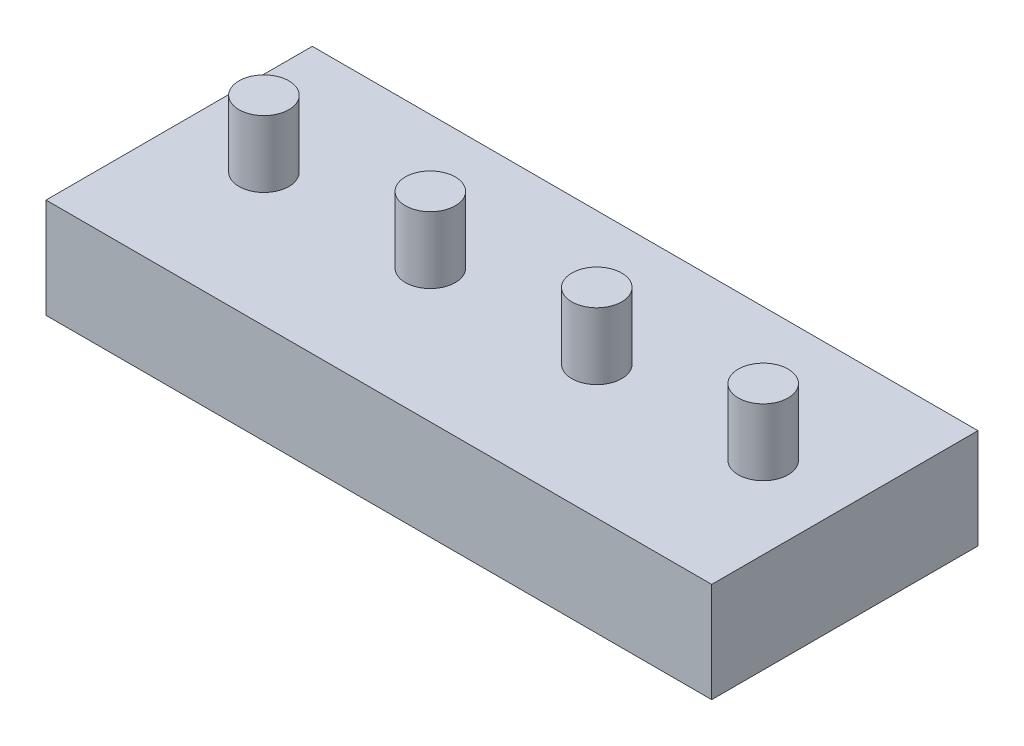
ISO-10303-21;
HEADER;
FILE_DESCRIPTION(('STEP AP214'),'2;1');
FILE_NAME('part.step','',(''),(''),'','','');
FILE_SCHEMA(('AUTOMOTIVE_DESIGN { 1 0 10303 214 1 1 1 1 }'));
ENDSEC;
DATA;
#1=APPLICATION_CONTEXT('core data for automotive mechanical design processes');
#2=APPLICATION_PROTOCOL_DEFINITION('international standard','automotive_design',2000,#1);
#3=PRODUCT_CONTEXT('',#1,'mechanical');
#4=PRODUCT('Part','Part','',(#3));
#5=PRODUCT_RELATED_PRODUCT_CATEGORY('part','',(#4));
#6=PRODUCT_DEFINITION_FORMATION('','',#4);
#7=PRODUCT_DEFINITION_CONTEXT('part definition',#1,'design');
#8=PRODUCT_DEFINITION('design','',#6,#7);
#9=PRODUCT_DEFINITION_SHAPE('','',#8);
#10=(LENGTH_UNIT() NAMED_UNIT(*) SI_UNIT(.MILLI.,.METRE.));
#11=(NAMED_UNIT(*) PLANE_ANGLE_UNIT() SI_UNIT($,.RADIAN.));
#12=(NAMED_UNIT(*) SI_UNIT($,.STERADIAN.) SOLID_ANGLE_UNIT());
#13=UNCERTAINTY_MEASURE_WITH_UNIT(LENGTH_MEASURE(1.E-05),#10,'distance_accuracy_value','');
#14=(GEOMETRIC_REPRESENTATION_CONTEXT(3) GLOBAL_UNCERTAINTY_ASSIGNED_CONTEXT((#13)) GLOBAL_UNIT_ASSIGNED_CONTEXT((#10,
#11,#12)) REPRESENTATION_CONTEXT('',''));
#15=CARTESIAN_POINT('',(0.,0.,0.));
#16=DIRECTION('',(0.,0.,1.));
#17=DIRECTION('',(1.,0.,0.));
#18=AXIS2_PLACEMENT_3D('',#15,#16,#17);
#19=CARTESIAN_POINT('',(7.5,5.,0.));
#20=DIRECTION('',(0.,-1.,0.));
#21=DIRECTION('',(0.,0.,-1.));
#22=AXIS2_PLACEMENT_3D('',#19,#20,#21);
#23=CYLINDRICAL_SURFACE('',#22,0.75);
#24=CARTESIAN_POINT('',(7.5,5.,0.));
#25=DIRECTION('',(0.,1.,0.));
#26=DIRECTION('',(0.,0.,1.));
#27=AXIS2_PLACEMENT_3D('',#24,#25,#26);
#28=CIRCLE('',#27,0.75);
#29=CARTESIAN_POINT('',(7.5,5.,0.75));
#30=VERTEX_POINT('',#29);
#31=EDGE_CURVE('E11',#30,#30,#28,.T.);
#32=ORIENTED_EDGE('',*,*,#31,.F.);
#33=EDGE_LOOP('',(#32));
#34=FACE_BOUND('',#33,.T.);
#35=CARTESIAN_POINT('',(7.5,0.,0.));
#36=DIRECTION('',(0.,1.,0.));
#37=DIRECTION('',(0.,0.,1.));
#38=AXIS2_PLACEMENT_3D('',#35,#36,#37);
#39=CIRCLE('',#38,0.75);
#40=CARTESIAN_POINT('',(7.5,0.,0.75));
#41=VERTEX_POINT('',#40);
#42=EDGE_CURVE('E43',#41,#41,#39,.T.);
#43=ORIENTED_EDGE('',*,*,#42,.T.);
#44=EDGE_LOOP('',(#43));
#45=FACE_BOUND('',#44,.T.);
#46=ADVANCED_FACE('F40',(#34,#45),#23,.T.);
#47=CARTESIAN_POINT('',(7.5,5.,0.));
#48=DIRECTION('',(0.,1.,0.));
#49=DIRECTION('',(0.,0.,1.));
#50=AXIS2_PLACEMENT_3D('',#47,#48,#49);
#51=PLANE('',#50);
#52=ORIENTED_EDGE('',*,*,#31,.T.);
#53=EDGE_LOOP('',(#52));
#54=FACE_BOUND('',#53,.T.);
#55=ADVANCED_FACE('F55',(#54),#51,.T.);
#56=CARTESIAN_POINT('',(7.5,0.,0.));
#57=DIRECTION('',(0.,1.,0.));
#58=DIRECTION('',(0.,0.,1.));
#59=AXIS2_PLACEMENT_3D('',#56,#57,#58);
#60=PLANE('',#59);
#61=ORIENTED_EDGE('',*,*,#42,.F.);
#62=EDGE_LOOP('',(#61));
#63=FACE_BOUND('',#62,.T.);
#64=ADVANCED_FACE('F53',(#63),#60,.F.);
#65=CLOSED_SHELL('',(#46,#55,#64));
#66=MANIFOLD_SOLID_BREP('B2',#65);
#67=CARTESIAN_POINT('',(2.5,5.,0.));
#68=DIRECTION('',(0.,-1.,0.));
#69=DIRECTION('',(0.,0.,-1.));
#70=AXIS2_PLACEMENT_3D('',#67,#68,#69);
#71=CYLINDRICAL_SURFACE('',#70,0.750000000000001);
#72=CARTESIAN_POINT('',(2.5,5.,0.));
#73=DIRECTION('',(0.,1.,0.));
#74=DIRECTION('',(0.,0.,1.));
#75=AXIS2_PLACEMENT_3D('',#72,#73,#74);
#76=CIRCLE('',#75,0.750000000000001);
#77=CARTESIAN_POINT('',(2.5,5.,0.750000000000001));
#78=VERTEX_POINT('',#77);
#79=EDGE_CURVE('E39',#78,#78,#76,.T.);
#80=ORIENTED_EDGE('',*,*,#79,.F.);
#81=EDGE_LOOP('',(#80));
#82=FACE_BOUND('',#81,.T.);
#83=CARTESIAN_POINT('',(2.5,0.,0.));
#84=DIRECTION('',(0.,1.,0.));
#85=DIRECTION('',(0.,0.,1.));
#86=AXIS2_PLACEMENT_3D('',#83,#84,#85);
#87=CIRCLE('',#86,0.750000000000001);
#88=CARTESIAN_POINT('',(2.5,0.,0.750000000000001));
#89=VERTEX_POINT('',#88);
#90=EDGE_CURVE('E92',#89,#89,#87,.T.);
#91=ORIENTED_EDGE('',*,*,#90,.T.);
#92=EDGE_LOOP('',(#91));
#93=FACE_BOUND('',#92,.T.);
#94=ADVANCED_FACE('F89',(#82,#93),#71,.T.);
#95=CARTESIAN_POINT('',(2.5,5.,0.));
#96=DIRECTION('',(0.,1.,0.));
#97=DIRECTION('',(0.,0.,1.));
#98=AXIS2_PLACEMENT_3D('',#95,#96,#97);
#99=PLANE('',#98);
#100=ORIENTED_EDGE('',*,*,#79,.T.);
#101=EDGE_LOOP('',(#100));
#102=FACE_BOUND('',#101,.T.);
#103=ADVANCED_FACE('F104',(#102),#99,.T.);
#104=CARTESIAN_POINT('',(2.5,0.,0.));
#105=DIRECTION('',(0.,1.,0.));
#106=DIRECTION('',(0.,0.,1.));
#107=AXIS2_PLACEMENT_3D('',#104,#105,#106);
#108=PLANE('',#107);
#109=ORIENTED_EDGE('',*,*,#90,.F.);
#110=EDGE_LOOP('',(#109));
#111=FACE_BOUND('',#110,.T.);
#112=ADVANCED_FACE('F102',(#111),#108,.F.);
#113=CLOSED_SHELL('',(#94,#103,#112));
#114=MANIFOLD_SOLID_BREP('B6',#113);
#115=CARTESIAN_POINT('',(-2.5,5.,0.));
#116=DIRECTION('',(0.,-1.,0.));
#117=DIRECTION('',(0.,0.,-1.));
#118=AXIS2_PLACEMENT_3D('',#115,#116,#117);
#119=CYLINDRICAL_SURFACE('',#118,0.750000000000001);
#120=CARTESIAN_POINT('',(-2.5,5.,0.));
#121=DIRECTION('',(0.,1.,0.));
#122=DIRECTION('',(0.,0.,1.));
#123=AXIS2_PLACEMENT_3D('',#120,#121,#122);
#124=CIRCLE('',#123,0.750000000000001);
#125=CARTESIAN_POINT('',(-2.5,5.,0.750000000000001));
#126=VERTEX_POINT('',#125);
#127=EDGE_CURVE('E88',#126,#126,#124,.T.);
#128=ORIENTED_EDGE('',*,*,#127,.F.);
#129=EDGE_LOOP('',(#128));
#130=FACE_BOUND('',#129,.T.);
#131=CARTESIAN_POINT('',(-2.5,0.,0.));
#132=DIRECTION('',(0.,1.,0.));
#133=DIRECTION('',(0.,0.,1.));
#134=AXIS2_PLACEMENT_3D('',#131,#132,#133);
#135=CIRCLE('',#134,0.750000000000001);
#136=CARTESIAN_POINT('',(-2.5,0.,0.750000000000001));
#137=VERTEX_POINT('',#136);
#138=EDGE_CURVE('E141',#137,#137,#135,.T.);
#139=ORIENTED_EDGE('',*,*,#138,.T.);
#140=EDGE_LOOP('',(#139));
#141=FACE_BOUND('',#140,.T.);
#142=ADVANCED_FACE('F138',(#130,#141),#119,.T.);
#143=CARTESIAN_POINT('',(-2.5,5.,0.));
#144=DIRECTION('',(0.,1.,0.));
#145=DIRECTION('',(0.,0.,1.));
#146=AXIS2_PLACEMENT_3D('',#143,#144,#145);
#147=PLANE('',#146);
#148=ORIENTED_EDGE('',*,*,#127,.T.);
#149=EDGE_LOOP('',(#148));
#150=FACE_BOUND('',#149,.T.);
#151=ADVANCED_FACE('F153',(#150),#147,.T.);
#152=CARTESIAN_POINT('',(-2.5,0.,0.));
#153=DIRECTION('',(0.,1.,0.));
#154=DIRECTION('',(0.,0.,1.));
#155=AXIS2_PLACEMENT_3D('',#152,#153,#154);
#156=PLANE('',#155);
#157=ORIENTED_EDGE('',*,*,#138,.F.);
#158=EDGE_LOOP('',(#157));
#159=FACE_BOUND('',#158,.T.);
#160=ADVANCED_FACE('F151',(#159),#156,.F.);
#161=CLOSED_SHELL('',(#142,#151,#160));
#162=MANIFOLD_SOLID_BREP('B34',#161);
#163=CARTESIAN_POINT('',(-7.5,5.,0.));
#164=DIRECTION('',(0.,-1.,0.));
#165=DIRECTION('',(0.,0.,-1.));
#166=AXIS2_PLACEMENT_3D('',#163,#164,#165);
#167=CYLINDRICAL_SURFACE('',#166,0.75);
#168=CARTESIAN_POINT('',(-7.5,5.,0.));
#169=DIRECTION('',(0.,1.,0.));
#170=DIRECTION('',(0.,0.,1.));
#171=AXIS2_PLACEMENT_3D('',#168,#169,#170);
#172=CIRCLE('',#171,0.75);
#173=CARTESIAN_POINT('',(-7.5,5.,0.75));
#174=VERTEX_POINT('',#173);
#175=EDGE_CURVE('E137',#174,#174,#172,.T.);
#176=ORIENTED_EDGE('',*,*,#175,.F.);
#177=EDGE_LOOP('',(#176));
#178=FACE_BOUND('',#177,.T.);
#179=CARTESIAN_POINT('',(-7.5,0.,0.));
#180=DIRECTION('',(0.,1.,0.));
#181=DIRECTION('',(0.,0.,1.));
#182=AXIS2_PLACEMENT_3D('',#179,#180,#181);
#183=CIRCLE('',#182,0.75);
#184=CARTESIAN_POINT('',(-7.5,0.,0.75));
#185=VERTEX_POINT('',#184);
#186=EDGE_CURVE('E191',#185,#185,#183,.T.);
#187=ORIENTED_EDGE('',*,*,#186,.T.);
#188=EDGE_LOOP('',(#187));
#189=FACE_BOUND('',#188,.T.);
#190=ADVANCED_FACE('F188',(#178,#189),#167,.T.);
#191=CARTESIAN_POINT('',(-7.5,5.,0.));
#192=DIRECTION('',(0.,1.,0.));
#193=DIRECTION('',(0.,0.,1.));
#194=AXIS2_PLACEMENT_3D('',#191,#192,#193);
#195=PLANE('',#194);
#196=ORIENTED_EDGE('',*,*,#175,.T.);
#197=EDGE_LOOP('',(#196));
#198=FACE_BOUND('',#197,.T.);
#199=ADVANCED_FACE('F203',(#198),#195,.T.);
#200=CARTESIAN_POINT('',(-7.5,0.,0.));
#201=DIRECTION('',(0.,1.,0.));
#202=DIRECTION('',(0.,0.,1.));
#203=AXIS2_PLACEMENT_3D('',#200,#201,#202);
#204=PLANE('',#203);
#205=ORIENTED_EDGE('',*,*,#186,.F.);
#206=EDGE_LOOP('',(#205));
#207=FACE_BOUND('',#206,.T.);
#208=ADVANCED_FACE('F201',(#207),#204,.F.);
#209=CLOSED_SHELL('',(#190,#199,#208));
#210=MANIFOLD_SOLID_BREP('B83',#209);
#211=CARTESIAN_POINT('',(-10.04674768572,3.,-4.));
#212=DIRECTION('',(1.,0.,0.));
#213=DIRECTION('',(0.,0.,-1.));
#214=AXIS2_PLACEMENT_3D('',#211,#212,#213);
#215=PLANE('',#214);
#216=DIRECTION('',(0.,0.,1.));
#217=VECTOR('',#216,1.);
#218=CARTESIAN_POINT('',(-10.04674768572,0.,-4.));
#219=LINE('',#218,#217);
#220=CARTESIAN_POINT('',(-10.04674768572,0.,-4.));
#221=VERTEX_POINT('',#220);
#222=CARTESIAN_POINT('',(-10.04674768572,0.,4.));
#223=VERTEX_POINT('',#222);
#224=EDGE_CURVE('E292',#221,#223,#219,.T.);
#225=ORIENTED_EDGE('',*,*,#224,.T.);
#226=DIRECTION('',(0.,-1.,0.));
#227=VECTOR('',#226,1.);
#228=CARTESIAN_POINT('',(-10.04674768572,3.,4.));
#229=LINE('',#228,#227);
#230=CARTESIAN_POINT('',(-10.04674768572,3.,4.));
#231=VERTEX_POINT('',#230);
#232=EDGE_CURVE('E186',#231,#223,#229,.T.);
#233=ORIENTED_EDGE('',*,*,#232,.F.);
#234=DIRECTION('',(0.,0.,1.));
#235=VECTOR('',#234,1.);
#236=CARTESIAN_POINT('',(-10.04674768572,3.,-4.));
#237=LINE('',#236,#235);
#238=CARTESIAN_POINT('',(-10.04674768572,3.,-4.));
#239=VERTEX_POINT('',#238);
#240=EDGE_CURVE('E280',#239,#231,#237,.T.);
#241=ORIENTED_EDGE('',*,*,#240,.F.);
#242=DIRECTION('',(0.,-1.,0.));
#243=VECTOR('',#242,1.);
#244=CARTESIAN_POINT('',(-10.04674768572,3.,-4.));
#245=LINE('',#244,#243);
#246=EDGE_CURVE('E288',#239,#221,#245,.T.);
#247=ORIENTED_EDGE('',*,*,#246,.T.);
#248=EDGE_LOOP('',(#225,#233,#241,#247));
#249=FACE_BOUND('',#248,.T.);
#250=ADVANCED_FACE('F229',(#249),#215,.F.);
#251=CARTESIAN_POINT('',(-10.04674768572,3.,4.));
#252=DIRECTION('',(0.,0.,-1.));
#253=DIRECTION('',(-1.,0.,0.));
#254=AXIS2_PLACEMENT_3D('',#251,#252,#253);
#255=PLANE('',#254);
#256=DIRECTION('',(1.,0.,0.));
#257=VECTOR('',#256,1.);
#258=CARTESIAN_POINT('',(-10.04674768572,0.,4.));
#259=LINE('',#258,#257);
#260=CARTESIAN_POINT('',(9.95325231427999,0.,4.));
#261=VERTEX_POINT('',#260);
#262=EDGE_CURVE('E284',#223,#261,#259,.T.);
#263=ORIENTED_EDGE('',*,*,#262,.T.);
#264=DIRECTION('',(0.,-1.,0.));
#265=VECTOR('',#264,1.);
#266=CARTESIAN_POINT('',(9.95325231427999,3.,4.));
#267=LINE('',#266,#265);
#268=CARTESIAN_POINT('',(9.95325231427999,3.,4.));
#269=VERTEX_POINT('',#268);
#270=EDGE_CURVE('E237',#269,#261,#267,.T.);
#271=ORIENTED_EDGE('',*,*,#270,.F.);
#272=DIRECTION('',(1.,0.,0.));
#273=VECTOR('',#272,1.);
#274=CARTESIAN_POINT('',(-10.04674768572,3.,4.));
#275=LINE('',#274,#273);
#276=EDGE_CURVE('E275',#231,#269,#275,.T.);
#277=ORIENTED_EDGE('',*,*,#276,.F.);
#278=ORIENTED_EDGE('',*,*,#232,.T.);
#279=EDGE_LOOP('',(#263,#271,#277,#278));
#280=FACE_BOUND('',#279,.T.);
#281=ADVANCED_FACE('F283',(#280),#255,.F.);
#282=CARTESIAN_POINT('',(9.95325231427999,3.,-4.));
#283=DIRECTION('',(-1.,0.,0.));
#284=DIRECTION('',(0.,0.,1.));
#285=AXIS2_PLACEMENT_3D('',#282,#283,#284);
#286=PLANE('',#285);
#287=DIRECTION('',(0.,0.,-1.));
#288=VECTOR('',#287,1.);
#289=CARTESIAN_POINT('',(9.95325231427999,0.,-4.));
#290=LINE('',#289,#288);
#291=CARTESIAN_POINT('',(9.95325231427999,0.,-4.));
#292=VERTEX_POINT('',#291);
#293=EDGE_CURVE('E262',#261,#292,#290,.T.);
#294=ORIENTED_EDGE('',*,*,#293,.T.);
#295=DIRECTION('',(0.,-1.,0.));
#296=VECTOR('',#295,1.);
#297=CARTESIAN_POINT('',(9.95325231427999,3.,-4.));
#298=LINE('',#297,#296);
#299=CARTESIAN_POINT('',(9.95325231427999,3.,-4.));
#300=VERTEX_POINT('',#299);
#301=EDGE_CURVE('E285',#300,#292,#298,.T.);
#302=ORIENTED_EDGE('',*,*,#301,.F.);
#303=DIRECTION('',(0.,0.,-1.));
#304=VECTOR('',#303,1.);
#305=CARTESIAN_POINT('',(9.95325231427999,3.,-4.));
#306=LINE('',#305,#304);
#307=EDGE_CURVE('E278',#269,#300,#306,.T.);
#308=ORIENTED_EDGE('',*,*,#307,.F.);
#309=ORIENTED_EDGE('',*,*,#270,.T.);
#310=EDGE_LOOP('',(#294,#302,#308,#309));
#311=FACE_BOUND('',#310,.T.);
#312=ADVANCED_FACE('F286',(#311),#286,.F.);
#313=CARTESIAN_POINT('',(-10.04674768572,3.,-4.));
#314=DIRECTION('',(0.,0.,1.));
#315=DIRECTION('',(1.,0.,0.));
#316=AXIS2_PLACEMENT_3D('',#313,#314,#315);
#317=PLANE('',#316);
#318=DIRECTION('',(-1.,0.,0.));
#319=VECTOR('',#318,1.);
#320=CARTESIAN_POINT('',(-10.04674768572,0.,-4.));
#321=LINE('',#320,#319);
#322=EDGE_CURVE('E268',#292,#221,#321,.T.);
#323=ORIENTED_EDGE('',*,*,#322,.T.);
#324=ORIENTED_EDGE('',*,*,#246,.F.);
#325=DIRECTION('',(-1.,0.,0.));
#326=VECTOR('',#325,1.);
#327=CARTESIAN_POINT('',(-10.04674768572,3.,-4.));
#328=LINE('',#327,#326);
#329=EDGE_CURVE('E245',#300,#239,#328,.T.);
#330=ORIENTED_EDGE('',*,*,#329,.F.);
#331=ORIENTED_EDGE('',*,*,#301,.T.);
#332=EDGE_LOOP('',(#323,#324,#330,#331));
#333=FACE_BOUND('',#332,.T.);
#334=ADVANCED_FACE('F299',(#333),#317,.F.);
#335=CARTESIAN_POINT('',(0.,3.,0.));
#336=DIRECTION('',(0.,1.,0.));
#337=DIRECTION('',(0.,0.,1.));
#338=AXIS2_PLACEMENT_3D('',#335,#336,#337);
#339=PLANE('',#338);
#340=ORIENTED_EDGE('',*,*,#240,.T.);
#341=ORIENTED_EDGE('',*,*,#276,.T.);
#342=ORIENTED_EDGE('',*,*,#307,.T.);
#343=ORIENTED_EDGE('',*,*,#329,.T.);
#344=EDGE_LOOP('',(#340,#341,#342,#343));
#345=FACE_BOUND('',#344,.T.);
#346=ADVANCED_FACE('F276',(#345),#339,.T.);
#347=CARTESIAN_POINT('',(0.,0.,0.));
#348=DIRECTION('',(0.,1.,0.));
#349=DIRECTION('',(0.,0.,1.));
#350=AXIS2_PLACEMENT_3D('',#347,#348,#349);
#351=PLANE('',#350);
#352=ORIENTED_EDGE('',*,*,#224,.F.);
#353=ORIENTED_EDGE('',*,*,#322,.F.);
#354=ORIENTED_EDGE('',*,*,#293,.F.);
#355=ORIENTED_EDGE('',*,*,#262,.F.);
#356=EDGE_LOOP('',(#352,#353,#354,#355));
#357=FACE_BOUND('',#356,.T.);
#358=ADVANCED_FACE('F302',(#357),#351,.F.);
#359=CLOSED_SHELL('',(#250,#281,#312,#334,#346,#358));
#360=MANIFOLD_SOLID_BREP('B132',#359);
#361=ADVANCED_BREP_SHAPE_REPRESENTATION('',(#18,#66,#114,#162,#210,#360),#14);
#362=SHAPE_DEFINITION_REPRESENTATION(#9,#361);
ENDSEC;
END-ISO-10303-21;
